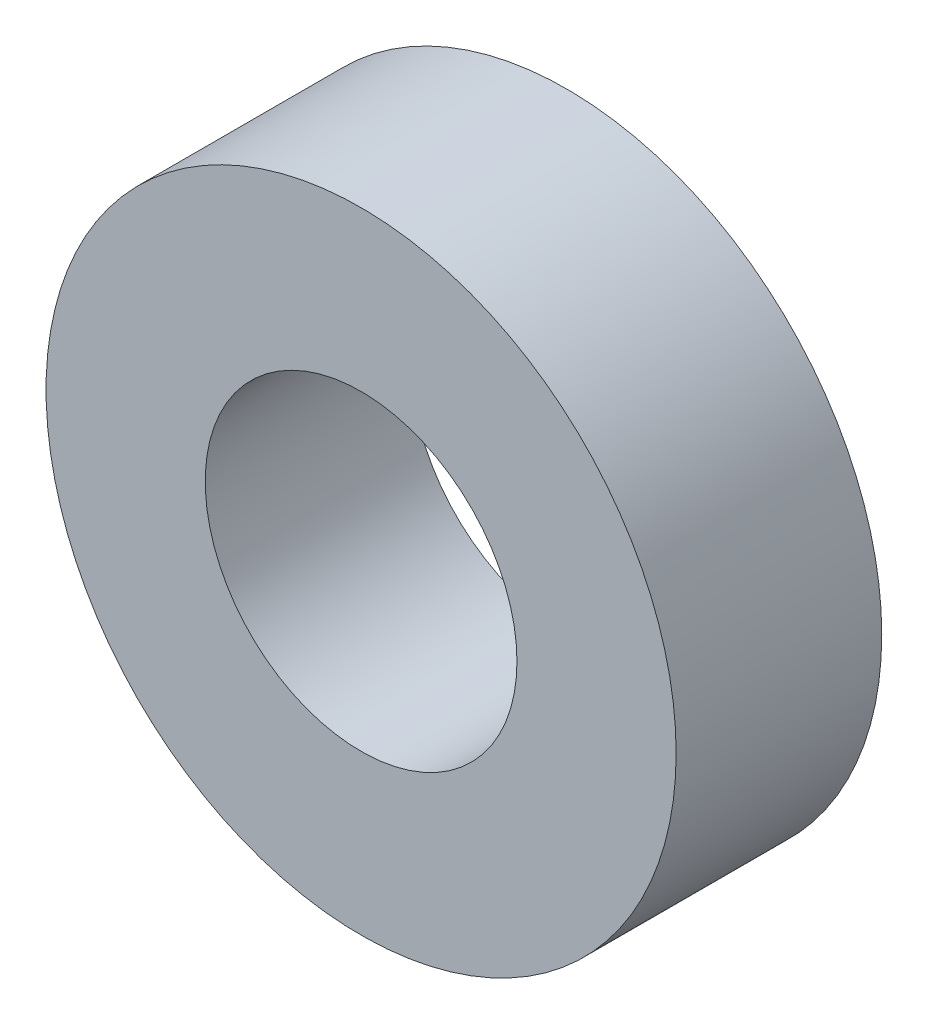
ISO-10303-21;
HEADER;
FILE_DESCRIPTION(('STEP AP214'),'2;1');
FILE_NAME('part.step','',(''),(''),'','','');
FILE_SCHEMA(('AUTOMOTIVE_DESIGN { 1 0 10303 214 1 1 1 1 }'));
ENDSEC;
DATA;
#1=APPLICATION_CONTEXT('core data for automotive mechanical design processes');
#2=APPLICATION_PROTOCOL_DEFINITION('international standard','automotive_design',2000,#1);
#3=PRODUCT_CONTEXT('',#1,'mechanical');
#4=PRODUCT('Part','Part','',(#3));
#5=PRODUCT_RELATED_PRODUCT_CATEGORY('part','',(#4));
#6=PRODUCT_DEFINITION_FORMATION('','',#4);
#7=PRODUCT_DEFINITION_CONTEXT('part definition',#1,'design');
#8=PRODUCT_DEFINITION('design','',#6,#7);
#9=PRODUCT_DEFINITION_SHAPE('','',#8);
#10=(LENGTH_UNIT() NAMED_UNIT(*) SI_UNIT(.MILLI.,.METRE.));
#11=(NAMED_UNIT(*) PLANE_ANGLE_UNIT() SI_UNIT($,.RADIAN.));
#12=(NAMED_UNIT(*) SI_UNIT($,.STERADIAN.) SOLID_ANGLE_UNIT());
#13=UNCERTAINTY_MEASURE_WITH_UNIT(LENGTH_MEASURE(1.E-05),#10,'distance_accuracy_value','');
#14=(GEOMETRIC_REPRESENTATION_CONTEXT(3) GLOBAL_UNCERTAINTY_ASSIGNED_CONTEXT((#13)) GLOBAL_UNIT_ASSIGNED_CONTEXT((#10,
#11,#12)) REPRESENTATION_CONTEXT('',''));
#15=CARTESIAN_POINT('',(0.,0.,0.));
#16=DIRECTION('',(0.,0.,1.));
#17=DIRECTION('',(1.,0.,0.));
#18=AXIS2_PLACEMENT_3D('',#15,#16,#17);
#19=CARTESIAN_POINT('',(0.,0.,-1.55));
#20=DIRECTION('',(0.,0.,1.));
#21=DIRECTION('',(1.,0.,0.));
#22=AXIS2_PLACEMENT_3D('',#19,#20,#21);
#23=CYLINDRICAL_SURFACE('',#22,4.75);
#24=CARTESIAN_POINT('',(0.,0.,-1.55));
#25=DIRECTION('',(0.,0.,1.));
#26=DIRECTION('',(1.,0.,0.));
#27=AXIS2_PLACEMENT_3D('',#24,#25,#26);
#28=CIRCLE('',#27,4.75);
#29=CARTESIAN_POINT('',(4.75,0.,-1.55));
#30=VERTEX_POINT('',#29);
#31=EDGE_CURVE('E10',#30,#30,#28,.T.);
#32=CARTESIAN_POINT('',(0.,0.,1.55));
#33=DIRECTION('',(0.,0.,1.));
#34=DIRECTION('',(1.,0.,0.));
#35=AXIS2_PLACEMENT_3D('',#32,#33,#34);
#36=CIRCLE('',#35,4.75);
#37=CARTESIAN_POINT('',(4.75,0.,1.55));
#38=VERTEX_POINT('',#37);
#39=EDGE_CURVE('E33',#38,#38,#36,.T.);
#40=CARTESIAN_POINT('',(4.75,0.,-1.55));
#41=CARTESIAN_POINT('',(4.75,0.,-1.51770833333333));
#42=CARTESIAN_POINT('',(4.75,0.,-1.48541666666667));
#43=CARTESIAN_POINT('',(4.75,0.,-1.42083333333333));
#44=CARTESIAN_POINT('',(4.75,0.,-1.38854166666667));
#45=CARTESIAN_POINT('',(4.75,0.,-1.32395833333333));
#46=CARTESIAN_POINT('',(4.75,0.,-1.29166666666667));
#47=CARTESIAN_POINT('',(4.75,0.,-1.22708333333333));
#48=CARTESIAN_POINT('',(4.75,0.,-1.19479166666667));
#49=CARTESIAN_POINT('',(4.75,0.,-1.13020833333333));
#50=CARTESIAN_POINT('',(4.75,0.,-1.09791666666667));
#51=CARTESIAN_POINT('',(4.75,0.,-1.03333333333333));
#52=CARTESIAN_POINT('',(4.75,0.,-1.00104166666667));
#53=CARTESIAN_POINT('',(4.75,0.,-0.936458333333333));
#54=CARTESIAN_POINT('',(4.75,0.,-0.904166666666667));
#55=CARTESIAN_POINT('',(4.75,0.,-0.839583333333333));
#56=CARTESIAN_POINT('',(4.75,0.,-0.807291666666667));
#57=CARTESIAN_POINT('',(4.75,0.,-0.742708333333333));
#58=CARTESIAN_POINT('',(4.75,0.,-0.710416666666667));
#59=CARTESIAN_POINT('',(4.75,0.,-0.645833333333333));
#60=CARTESIAN_POINT('',(4.75,0.,-0.613541666666667));
#61=CARTESIAN_POINT('',(4.75,0.,-0.548958333333333));
#62=CARTESIAN_POINT('',(4.75,0.,-0.516666666666667));
#63=CARTESIAN_POINT('',(4.75,0.,-0.452083333333334));
#64=CARTESIAN_POINT('',(4.75,0.,-0.419791666666667));
#65=CARTESIAN_POINT('',(4.75,0.,-0.355208333333334));
#66=CARTESIAN_POINT('',(4.75,0.,-0.322916666666667));
#67=CARTESIAN_POINT('',(4.75,0.,-0.258333333333334));
#68=CARTESIAN_POINT('',(4.75,0.,-0.226041666666667));
#69=CARTESIAN_POINT('',(4.75,0.,-0.161458333333333));
#70=CARTESIAN_POINT('',(4.75,0.,-0.129166666666667));
#71=CARTESIAN_POINT('',(4.75,0.,-0.0645833333333335));
#72=CARTESIAN_POINT('',(4.75,0.,-0.0322916666666669));
#73=CARTESIAN_POINT('',(4.75,0.,0.0322916666666664));
#74=CARTESIAN_POINT('',(4.75,0.,0.0645833333333331));
#75=CARTESIAN_POINT('',(4.75,0.,0.129166666666666));
#76=CARTESIAN_POINT('',(4.75,0.,0.161458333333333));
#77=CARTESIAN_POINT('',(4.75,0.,0.226041666666666));
#78=CARTESIAN_POINT('',(4.75,0.,0.258333333333333));
#79=CARTESIAN_POINT('',(4.75,0.,0.322916666666667));
#80=CARTESIAN_POINT('',(4.75,0.,0.355208333333333));
#81=CARTESIAN_POINT('',(4.75,0.,0.419791666666666));
#82=CARTESIAN_POINT('',(4.75,0.,0.452083333333333));
#83=CARTESIAN_POINT('',(4.75,0.,0.516666666666666));
#84=CARTESIAN_POINT('',(4.75,0.,0.548958333333333));
#85=CARTESIAN_POINT('',(4.75,0.,0.613541666666667));
#86=CARTESIAN_POINT('',(4.75,0.,0.645833333333333));
#87=CARTESIAN_POINT('',(4.75,0.,0.710416666666666));
#88=CARTESIAN_POINT('',(4.75,0.,0.742708333333333));
#89=CARTESIAN_POINT('',(4.75,0.,0.807291666666667));
#90=CARTESIAN_POINT('',(4.75,0.,0.839583333333333));
#91=CARTESIAN_POINT('',(4.75,0.,0.904166666666667));
#92=CARTESIAN_POINT('',(4.75,0.,0.936458333333333));
#93=CARTESIAN_POINT('',(4.75,0.,1.00104166666667));
#94=CARTESIAN_POINT('',(4.75,0.,1.03333333333333));
#95=CARTESIAN_POINT('',(4.75,0.,1.09791666666667));
#96=CARTESIAN_POINT('',(4.75,0.,1.13020833333333));
#97=CARTESIAN_POINT('',(4.75,0.,1.19479166666667));
#98=CARTESIAN_POINT('',(4.75,0.,1.22708333333333));
#99=CARTESIAN_POINT('',(4.75,0.,1.29166666666667));
#100=CARTESIAN_POINT('',(4.75,0.,1.32395833333333));
#101=CARTESIAN_POINT('',(4.75,0.,1.38854166666667));
#102=CARTESIAN_POINT('',(4.75,0.,1.42083333333333));
#103=CARTESIAN_POINT('',(4.75,0.,1.48541666666667));
#104=CARTESIAN_POINT('',(4.75,0.,1.51770833333333));
#105=CARTESIAN_POINT('',(4.75,0.,1.55));
#106=B_SPLINE_CURVE_WITH_KNOTS('',3,(#40,#41,#42,#43,#44,#45,#46,#47,#48,#49,#50,#51,#52,#53,
#54,#55,#56,#57,#58,#59,#60,#61,#62,#63,#64,#65,#66,#67,#68,#69,#70,#71,#72,#73,#74,#75,#76,#77,
#78,#79,#80,#81,#82,#83,#84,#85,#86,#87,#88,#89,#90,#91,#92,#93,#94,#95,#96,#97,#98,#99,#100,
#101,#102,#103,#104,#105),.UNSPECIFIED.,.F.,.F.,(4,2,2,2,2,2,2,2,2,2,2,2,2,2,2,2,2,2,2,2,2,2,2,
2,2,2,2,2,2,2,2,2,4),(0.,0.0968750000000002,0.19375,0.290625,0.3875,0.484375,0.58125,0.678125,
0.775,0.871875,0.96875,1.065625,1.1625,1.259375,1.35625,1.453125,1.55,1.646875,1.74375,1.840625,
1.9375,2.034375,2.13125,2.228125,2.325,2.421875,2.51875,2.615625,2.7125,2.809375,2.90625,
3.003125,3.1),.UNSPECIFIED.);
#107=EDGE_CURVE('BSEAM30',#30,#38,#106,.T.);
#108=ORIENTED_EDGE('',*,*,#31,.T.);
#109=ORIENTED_EDGE('',*,*,#39,.F.);
#110=ORIENTED_EDGE('',*,*,#107,.T.);
#111=ORIENTED_EDGE('',*,*,#107,.F.);
#112=EDGE_LOOP('',(#108,#110,#109,#111));
#113=FACE_BOUND('',#112,.T.);
#114=ADVANCED_FACE('F30',(#113),#23,.T.);
#115=CARTESIAN_POINT('',(0.,0.,-1.55));
#116=DIRECTION('',(0.,0.,1.));
#117=DIRECTION('',(1.,0.,0.));
#118=AXIS2_PLACEMENT_3D('',#115,#116,#117);
#119=PLANE('',#118);
#120=CARTESIAN_POINT('',(0.,0.,-1.55));
#121=DIRECTION('',(0.,0.,1.));
#122=DIRECTION('',(1.,0.,0.));
#123=AXIS2_PLACEMENT_3D('',#120,#121,#122);
#124=CIRCLE('',#123,2.35);
#125=CARTESIAN_POINT('',(2.35,0.,-1.55));
#126=VERTEX_POINT('',#125);
#127=EDGE_CURVE('E40',#126,#126,#124,.T.);
#128=ORIENTED_EDGE('',*,*,#127,.T.);
#129=EDGE_LOOP('',(#128));
#130=FACE_BOUND('',#129,.T.);
#131=ORIENTED_EDGE('',*,*,#31,.F.);
#132=EDGE_LOOP('',(#131));
#133=FACE_BOUND('',#132,.T.);
#134=ADVANCED_FACE('F48',(#130,#133),#119,.F.);
#135=CARTESIAN_POINT('',(0.,0.,1.55));
#136=DIRECTION('',(0.,0.,1.));
#137=DIRECTION('',(1.,0.,0.));
#138=AXIS2_PLACEMENT_3D('',#135,#136,#137);
#139=PLANE('',#138);
#140=CARTESIAN_POINT('',(0.,0.,1.55));
#141=DIRECTION('',(0.,0.,1.));
#142=DIRECTION('',(1.,0.,0.));
#143=AXIS2_PLACEMENT_3D('',#140,#141,#142);
#144=CIRCLE('',#143,2.35);
#145=CARTESIAN_POINT('',(2.35,0.,1.55));
#146=VERTEX_POINT('',#145);
#147=EDGE_CURVE('E42',#146,#146,#144,.T.);
#148=ORIENTED_EDGE('',*,*,#147,.F.);
#149=EDGE_LOOP('',(#148));
#150=FACE_BOUND('',#149,.T.);
#151=ORIENTED_EDGE('',*,*,#39,.T.);
#152=EDGE_LOOP('',(#151));
#153=FACE_BOUND('',#152,.T.);
#154=ADVANCED_FACE('F54',(#150,#153),#139,.T.);
#155=CARTESIAN_POINT('',(0.,0.,-1.55));
#156=DIRECTION('',(0.,0.,1.));
#157=DIRECTION('',(1.,0.,0.));
#158=AXIS2_PLACEMENT_3D('',#155,#156,#157);
#159=CYLINDRICAL_SURFACE('',#158,2.35);
#160=CARTESIAN_POINT('',(2.35,0.,-1.55));
#161=CARTESIAN_POINT('',(2.35,0.,-1.51770833333333));
#162=CARTESIAN_POINT('',(2.35,0.,-1.48541666666667));
#163=CARTESIAN_POINT('',(2.35,0.,-1.42083333333333));
#164=CARTESIAN_POINT('',(2.35,0.,-1.38854166666667));
#165=CARTESIAN_POINT('',(2.35,0.,-1.32395833333333));
#166=CARTESIAN_POINT('',(2.35,0.,-1.29166666666667));
#167=CARTESIAN_POINT('',(2.35,0.,-1.22708333333333));
#168=CARTESIAN_POINT('',(2.35,0.,-1.19479166666667));
#169=CARTESIAN_POINT('',(2.35,0.,-1.13020833333333));
#170=CARTESIAN_POINT('',(2.35,0.,-1.09791666666667));
#171=CARTESIAN_POINT('',(2.35,0.,-1.03333333333333));
#172=CARTESIAN_POINT('',(2.35,0.,-1.00104166666667));
#173=CARTESIAN_POINT('',(2.35,0.,-0.936458333333333));
#174=CARTESIAN_POINT('',(2.35,0.,-0.904166666666667));
#175=CARTESIAN_POINT('',(2.35,0.,-0.839583333333333));
#176=CARTESIAN_POINT('',(2.35,0.,-0.807291666666667));
#177=CARTESIAN_POINT('',(2.35,0.,-0.742708333333333));
#178=CARTESIAN_POINT('',(2.35,0.,-0.710416666666667));
#179=CARTESIAN_POINT('',(2.35,0.,-0.645833333333333));
#180=CARTESIAN_POINT('',(2.35,0.,-0.613541666666667));
#181=CARTESIAN_POINT('',(2.35,0.,-0.548958333333333));
#182=CARTESIAN_POINT('',(2.35,0.,-0.516666666666667));
#183=CARTESIAN_POINT('',(2.35,0.,-0.452083333333333));
#184=CARTESIAN_POINT('',(2.35,0.,-0.419791666666667));
#185=CARTESIAN_POINT('',(2.35,0.,-0.355208333333333));
#186=CARTESIAN_POINT('',(2.35,0.,-0.322916666666667));
#187=CARTESIAN_POINT('',(2.35,0.,-0.258333333333333));
#188=CARTESIAN_POINT('',(2.35,0.,-0.226041666666667));
#189=CARTESIAN_POINT('',(2.35,0.,-0.161458333333333));
#190=CARTESIAN_POINT('',(2.35,0.,-0.129166666666667));
#191=CARTESIAN_POINT('',(2.35,0.,-0.0645833333333333));
#192=CARTESIAN_POINT('',(2.35,0.,-0.0322916666666667));
#193=CARTESIAN_POINT('',(2.35,0.,0.0322916666666667));
#194=CARTESIAN_POINT('',(2.35,0.,0.0645833333333333));
#195=CARTESIAN_POINT('',(2.35,0.,0.129166666666667));
#196=CARTESIAN_POINT('',(2.35,0.,0.161458333333333));
#197=CARTESIAN_POINT('',(2.35,0.,0.226041666666667));
#198=CARTESIAN_POINT('',(2.35,0.,0.258333333333333));
#199=CARTESIAN_POINT('',(2.35,0.,0.322916666666667));
#200=CARTESIAN_POINT('',(2.35,0.,0.355208333333333));
#201=CARTESIAN_POINT('',(2.35,0.,0.419791666666667));
#202=CARTESIAN_POINT('',(2.35,0.,0.452083333333333));
#203=CARTESIAN_POINT('',(2.35,0.,0.516666666666666));
#204=CARTESIAN_POINT('',(2.35,0.,0.548958333333333));
#205=CARTESIAN_POINT('',(2.35,0.,0.613541666666667));
#206=CARTESIAN_POINT('',(2.35,0.,0.645833333333333));
#207=CARTESIAN_POINT('',(2.35,0.,0.710416666666666));
#208=CARTESIAN_POINT('',(2.35,0.,0.742708333333333));
#209=CARTESIAN_POINT('',(2.35,0.,0.807291666666667));
#210=CARTESIAN_POINT('',(2.35,0.,0.839583333333333));
#211=CARTESIAN_POINT('',(2.35,0.,0.904166666666667));
#212=CARTESIAN_POINT('',(2.35,0.,0.936458333333333));
#213=CARTESIAN_POINT('',(2.35,0.,1.00104166666667));
#214=CARTESIAN_POINT('',(2.35,0.,1.03333333333333));
#215=CARTESIAN_POINT('',(2.35,0.,1.09791666666667));
#216=CARTESIAN_POINT('',(2.35,0.,1.13020833333333));
#217=CARTESIAN_POINT('',(2.35,0.,1.19479166666667));
#218=CARTESIAN_POINT('',(2.35,0.,1.22708333333333));
#219=CARTESIAN_POINT('',(2.35,0.,1.29166666666667));
#220=CARTESIAN_POINT('',(2.35,0.,1.32395833333333));
#221=CARTESIAN_POINT('',(2.35,0.,1.38854166666667));
#222=CARTESIAN_POINT('',(2.35,0.,1.42083333333333));
#223=CARTESIAN_POINT('',(2.35,0.,1.48541666666667));
#224=CARTESIAN_POINT('',(2.35,0.,1.51770833333333));
#225=CARTESIAN_POINT('',(2.35,0.,1.55));
#226=B_SPLINE_CURVE_WITH_KNOTS('',3,(#160,#161,#162,#163,#164,#165,#166,#167,#168,#169,#170,
#171,#172,#173,#174,#175,#176,#177,#178,#179,#180,#181,#182,#183,#184,#185,#186,#187,#188,#189,
#190,#191,#192,#193,#194,#195,#196,#197,#198,#199,#200,#201,#202,#203,#204,#205,#206,#207,#208,
#209,#210,#211,#212,#213,#214,#215,#216,#217,#218,#219,#220,#221,#222,#223,#224,#225),
.UNSPECIFIED.,.F.,.F.,(4,2,2,2,2,2,2,2,2,2,2,2,2,2,2,2,2,2,2,2,2,2,2,2,2,2,2,2,2,2,2,2,4),(0.,
0.096875,0.19375,0.290625,0.3875,0.484375,0.58125,0.678125,0.775,0.871875,0.96875,1.065625,
1.1625,1.259375,1.35625,1.453125,1.55,1.646875,1.74375,1.840625,1.9375,2.034375,2.13125,
2.228125,2.325,2.421875,2.51875,2.615625,2.7125,2.809375,2.90625,3.003125,3.1),.UNSPECIFIED.);
#227=EDGE_CURVE('BSEAM51',#126,#146,#226,.T.);
#228=ORIENTED_EDGE('',*,*,#127,.F.);
#229=ORIENTED_EDGE('',*,*,#147,.T.);
#230=ORIENTED_EDGE('',*,*,#227,.T.);
#231=ORIENTED_EDGE('',*,*,#227,.F.);
#232=EDGE_LOOP('',(#228,#230,#229,#231));
#233=FACE_BOUND('',#232,.T.);
#234=ADVANCED_FACE('F51',(#233),#159,.F.);
#235=CLOSED_SHELL('',(#114,#134,#154,#234));
#236=MANIFOLD_SOLID_BREP('B2',#235);
#237=ADVANCED_BREP_SHAPE_REPRESENTATION('',(#18,#236),#14);
#238=SHAPE_DEFINITION_REPRESENTATION(#9,#237);
ENDSEC;
END-ISO-10303-21;
